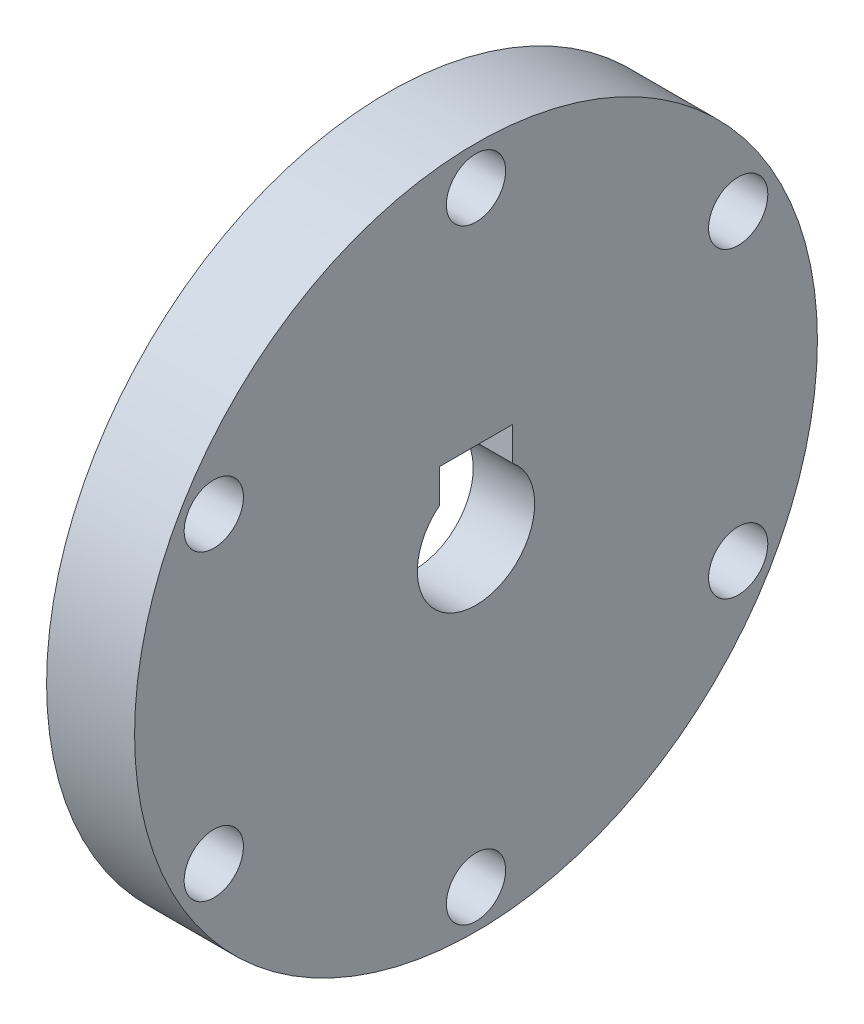
ISO-10303-21;
HEADER;
FILE_DESCRIPTION(('STEP AP214'),'2;1');
FILE_NAME('part.step','',(''),(''),'','','');
FILE_SCHEMA(('AUTOMOTIVE_DESIGN { 1 0 10303 214 1 1 1 1 }'));
ENDSEC;
DATA;
#1=APPLICATION_CONTEXT('core data for automotive mechanical design processes');
#2=APPLICATION_PROTOCOL_DEFINITION('international standard','automotive_design',2000,#1);
#3=PRODUCT_CONTEXT('',#1,'mechanical');
#4=PRODUCT('Part','Part','',(#3));
#5=PRODUCT_RELATED_PRODUCT_CATEGORY('part','',(#4));
#6=PRODUCT_DEFINITION_FORMATION('','',#4);
#7=PRODUCT_DEFINITION_CONTEXT('part definition',#1,'design');
#8=PRODUCT_DEFINITION('design','',#6,#7);
#9=PRODUCT_DEFINITION_SHAPE('','',#8);
#10=(LENGTH_UNIT() NAMED_UNIT(*) SI_UNIT(.MILLI.,.METRE.));
#11=(NAMED_UNIT(*) PLANE_ANGLE_UNIT() SI_UNIT($,.RADIAN.));
#12=(NAMED_UNIT(*) SI_UNIT($,.STERADIAN.) SOLID_ANGLE_UNIT());
#13=UNCERTAINTY_MEASURE_WITH_UNIT(LENGTH_MEASURE(1.E-05),#10,'distance_accuracy_value','');
#14=(GEOMETRIC_REPRESENTATION_CONTEXT(3) GLOBAL_UNCERTAINTY_ASSIGNED_CONTEXT((#13)) GLOBAL_UNIT_ASSIGNED_CONTEXT((#10,
#11,#12)) REPRESENTATION_CONTEXT('',''));
#15=CARTESIAN_POINT('',(0.,0.,0.));
#16=DIRECTION('',(0.,0.,1.));
#17=DIRECTION('',(1.,0.,0.));
#18=AXIS2_PLACEMENT_3D('',#15,#16,#17);
#19=CARTESIAN_POINT('',(6.,0.,0.));
#20=DIRECTION('',(1.,0.,0.));
#21=DIRECTION('',(0.,0.,-1.));
#22=AXIS2_PLACEMENT_3D('',#19,#20,#21);
#23=PLANE('',#22);
#24=DIRECTION('',(0.,1.,0.));
#25=VECTOR('',#24,1.);
#26=CARTESIAN_POINT('',(6.,3.1224989991992,-2.5));
#27=LINE('',#26,#25);
#28=CARTESIAN_POINT('',(6.,3.1224989991992,-2.5));
#29=VERTEX_POINT('',#28);
#30=CARTESIAN_POINT('',(6.,5.4224989991992,-2.5));
#31=VERTEX_POINT('',#30);
#32=EDGE_CURVE('E64',#29,#31,#27,.T.);
#33=ORIENTED_EDGE('',*,*,#32,.F.);
#34=CARTESIAN_POINT('',(6.,0.,0.));
#35=DIRECTION('',(1.,0.,0.));
#36=DIRECTION('',(0.,0.,-1.));
#37=AXIS2_PLACEMENT_3D('',#34,#35,#36);
#38=CIRCLE('',#37,4.);
#39=CARTESIAN_POINT('',(6.,3.1224989991992,2.5));
#40=VERTEX_POINT('',#39);
#41=EDGE_CURVE('E109',#40,#29,#38,.T.);
#42=ORIENTED_EDGE('',*,*,#41,.F.);
#43=DIRECTION('',(0.,-1.,0.));
#44=VECTOR('',#43,1.);
#45=CARTESIAN_POINT('',(6.,3.1224989991992,2.5));
#46=LINE('',#45,#44);
#47=CARTESIAN_POINT('',(6.,5.4224989991992,2.5));
#48=VERTEX_POINT('',#47);
#49=EDGE_CURVE('E92',#48,#40,#46,.T.);
#50=ORIENTED_EDGE('',*,*,#49,.F.);
#51=DIRECTION('',(0.,0.,1.));
#52=VECTOR('',#51,1.);
#53=CARTESIAN_POINT('',(6.,5.4224989991992,2.5));
#54=LINE('',#53,#52);
#55=EDGE_CURVE('E102',#31,#48,#54,.T.);
#56=ORIENTED_EDGE('',*,*,#55,.F.);
#57=EDGE_LOOP('',(#33,#42,#50,#56));
#58=FACE_BOUND('',#57,.T.);
#59=CARTESIAN_POINT('',(6.,-10.3199999999998,17.8747643341109));
#60=DIRECTION('',(1.,0.,0.));
#61=DIRECTION('',(0.,0.,-1.));
#62=AXIS2_PLACEMENT_3D('',#59,#60,#61);
#63=CIRCLE('',#62,2.01929999999999);
#64=CARTESIAN_POINT('',(6.,-10.3199999999998,15.8554643341109));
#65=VERTEX_POINT('',#64);
#66=EDGE_CURVE('E136',#65,#65,#63,.T.);
#67=ORIENTED_EDGE('',*,*,#66,.F.);
#68=EDGE_LOOP('',(#67));
#69=FACE_BOUND('',#68,.T.);
#70=CARTESIAN_POINT('',(6.,-10.3200000000001,-17.8747643341108));
#71=DIRECTION('',(1.,0.,0.));
#72=DIRECTION('',(0.,0.,-1.));
#73=AXIS2_PLACEMENT_3D('',#70,#71,#72);
#74=CIRCLE('',#73,2.01929999999999);
#75=CARTESIAN_POINT('',(6.,-10.3200000000001,-19.8940643341108));
#76=VERTEX_POINT('',#75);
#77=EDGE_CURVE('E152',#76,#76,#74,.T.);
#78=ORIENTED_EDGE('',*,*,#77,.F.);
#79=EDGE_LOOP('',(#78));
#80=FACE_BOUND('',#79,.T.);
#81=CARTESIAN_POINT('',(6.,20.64,0.));
#82=DIRECTION('',(1.,0.,0.));
#83=DIRECTION('',(0.,0.,-1.));
#84=AXIS2_PLACEMENT_3D('',#81,#82,#83);
#85=CIRCLE('',#84,2.01929999999999);
#86=CARTESIAN_POINT('',(6.,20.64,-2.01929999999999));
#87=VERTEX_POINT('',#86);
#88=EDGE_CURVE('E168',#87,#87,#85,.T.);
#89=ORIENTED_EDGE('',*,*,#88,.F.);
#90=EDGE_LOOP('',(#89));
#91=FACE_BOUND('',#90,.T.);
#92=CARTESIAN_POINT('',(6.,0.,0.));
#93=DIRECTION('',(1.,0.,0.));
#94=DIRECTION('',(0.,0.,-1.));
#95=AXIS2_PLACEMENT_3D('',#92,#93,#94);
#96=CIRCLE('',#95,23.2760744987721);
#97=CARTESIAN_POINT('',(6.,0.,-23.2760744987721));
#98=VERTEX_POINT('',#97);
#99=EDGE_CURVE('E176',#98,#98,#96,.T.);
#100=ORIENTED_EDGE('',*,*,#99,.T.);
#101=EDGE_LOOP('',(#100));
#102=FACE_BOUND('',#101,.T.);
#103=CARTESIAN_POINT('',(6.,10.32,-17.8747643341108));
#104=DIRECTION('',(1.,0.,0.));
#105=DIRECTION('',(0.,0.,-1.));
#106=AXIS2_PLACEMENT_3D('',#103,#104,#105);
#107=CIRCLE('',#106,2.01929999999999);
#108=CARTESIAN_POINT('',(6.,10.32,-19.8940643341108));
#109=VERTEX_POINT('',#108);
#110=EDGE_CURVE('E160',#109,#109,#107,.T.);
#111=ORIENTED_EDGE('',*,*,#110,.F.);
#112=EDGE_LOOP('',(#111));
#113=FACE_BOUND('',#112,.T.);
#114=CARTESIAN_POINT('',(6.,-20.64,1.44128349667445E-13));
#115=DIRECTION('',(1.,0.,0.));
#116=DIRECTION('',(0.,0.,-1.));
#117=AXIS2_PLACEMENT_3D('',#114,#115,#116);
#118=CIRCLE('',#117,2.01929999999999);
#119=CARTESIAN_POINT('',(6.,-20.64,-2.01929999999985));
#120=VERTEX_POINT('',#119);
#121=EDGE_CURVE('E144',#120,#120,#118,.T.);
#122=ORIENTED_EDGE('',*,*,#121,.F.);
#123=EDGE_LOOP('',(#122));
#124=FACE_BOUND('',#123,.T.);
#125=CARTESIAN_POINT('',(6.,10.3200000000002,17.8747643341107));
#126=DIRECTION('',(1.,0.,0.));
#127=DIRECTION('',(0.,0.,-1.));
#128=AXIS2_PLACEMENT_3D('',#125,#126,#127);
#129=CIRCLE('',#128,2.01929999999999);
#130=CARTESIAN_POINT('',(6.,10.3200000000002,15.8554643341107));
#131=VERTEX_POINT('',#130);
#132=EDGE_CURVE('E128',#131,#131,#129,.T.);
#133=ORIENTED_EDGE('',*,*,#132,.F.);
#134=EDGE_LOOP('',(#133));
#135=FACE_BOUND('',#134,.T.);
#136=ADVANCED_FACE('F47',(#58,#69,#80,#91,#102,#113,#124,#135),#23,.T.);
#137=CARTESIAN_POINT('',(0.,0.,0.));
#138=DIRECTION('',(1.,0.,0.));
#139=DIRECTION('',(0.,0.,-1.));
#140=AXIS2_PLACEMENT_3D('',#137,#138,#139);
#141=PLANE('',#140);
#142=CARTESIAN_POINT('',(0.,0.,0.));
#143=DIRECTION('',(1.,0.,0.));
#144=DIRECTION('',(0.,0.,-1.));
#145=AXIS2_PLACEMENT_3D('',#142,#143,#144);
#146=CIRCLE('',#145,17.46);
#147=CARTESIAN_POINT('',(0.,0.,-17.46));
#148=VERTEX_POINT('',#147);
#149=EDGE_CURVE('E180',#148,#148,#146,.F.);
#150=ORIENTED_EDGE('',*,*,#149,.F.);
#151=EDGE_LOOP('',(#150));
#152=FACE_BOUND('',#151,.T.);
#153=CARTESIAN_POINT('',(0.,0.,0.));
#154=DIRECTION('',(1.,0.,0.));
#155=DIRECTION('',(0.,0.,-1.));
#156=AXIS2_PLACEMENT_3D('',#153,#154,#155);
#157=CIRCLE('',#156,23.2760744987721);
#158=CARTESIAN_POINT('',(0.,0.,-23.2760744987721));
#159=VERTEX_POINT('',#158);
#160=EDGE_CURVE('E172',#159,#159,#157,.T.);
#161=ORIENTED_EDGE('',*,*,#160,.F.);
#162=EDGE_LOOP('',(#161));
#163=FACE_BOUND('',#162,.T.);
#164=CARTESIAN_POINT('',(0.,20.64,0.));
#165=DIRECTION('',(1.,0.,0.));
#166=DIRECTION('',(0.,0.,-1.));
#167=AXIS2_PLACEMENT_3D('',#164,#165,#166);
#168=CIRCLE('',#167,2.01929999999999);
#169=CARTESIAN_POINT('',(0.,20.64,-2.01929999999999));
#170=VERTEX_POINT('',#169);
#171=EDGE_CURVE('E164',#170,#170,#168,.T.);
#172=ORIENTED_EDGE('',*,*,#171,.T.);
#173=EDGE_LOOP('',(#172));
#174=FACE_BOUND('',#173,.T.);
#175=CARTESIAN_POINT('',(0.,10.32,-17.8747643341108));
#176=DIRECTION('',(1.,0.,0.));
#177=DIRECTION('',(0.,0.,-1.));
#178=AXIS2_PLACEMENT_3D('',#175,#176,#177);
#179=CIRCLE('',#178,2.01929999999999);
#180=CARTESIAN_POINT('',(0.,10.32,-19.8940643341108));
#181=VERTEX_POINT('',#180);
#182=EDGE_CURVE('E156',#181,#181,#179,.T.);
#183=ORIENTED_EDGE('',*,*,#182,.T.);
#184=EDGE_LOOP('',(#183));
#185=FACE_BOUND('',#184,.T.);
#186=CARTESIAN_POINT('',(0.,-10.3200000000001,-17.8747643341108));
#187=DIRECTION('',(1.,0.,0.));
#188=DIRECTION('',(0.,0.,-1.));
#189=AXIS2_PLACEMENT_3D('',#186,#187,#188);
#190=CIRCLE('',#189,2.01929999999999);
#191=CARTESIAN_POINT('',(0.,-10.3200000000001,-19.8940643341108));
#192=VERTEX_POINT('',#191);
#193=EDGE_CURVE('E148',#192,#192,#190,.T.);
#194=ORIENTED_EDGE('',*,*,#193,.T.);
#195=EDGE_LOOP('',(#194));
#196=FACE_BOUND('',#195,.T.);
#197=CARTESIAN_POINT('',(0.,-20.64,1.44128349667445E-13));
#198=DIRECTION('',(1.,0.,0.));
#199=DIRECTION('',(0.,0.,-1.));
#200=AXIS2_PLACEMENT_3D('',#197,#198,#199);
#201=CIRCLE('',#200,2.01929999999999);
#202=CARTESIAN_POINT('',(0.,-20.64,-2.01929999999985));
#203=VERTEX_POINT('',#202);
#204=EDGE_CURVE('E140',#203,#203,#201,.T.);
#205=ORIENTED_EDGE('',*,*,#204,.T.);
#206=EDGE_LOOP('',(#205));
#207=FACE_BOUND('',#206,.T.);
#208=CARTESIAN_POINT('',(0.,-10.3199999999998,17.8747643341109));
#209=DIRECTION('',(1.,0.,0.));
#210=DIRECTION('',(0.,0.,-1.));
#211=AXIS2_PLACEMENT_3D('',#208,#209,#210);
#212=CIRCLE('',#211,2.01929999999999);
#213=CARTESIAN_POINT('',(0.,-10.3199999999998,15.8554643341109));
#214=VERTEX_POINT('',#213);
#215=EDGE_CURVE('E132',#214,#214,#212,.T.);
#216=ORIENTED_EDGE('',*,*,#215,.T.);
#217=EDGE_LOOP('',(#216));
#218=FACE_BOUND('',#217,.T.);
#219=CARTESIAN_POINT('',(0.,10.3200000000002,17.8747643341107));
#220=DIRECTION('',(1.,0.,0.));
#221=DIRECTION('',(0.,0.,-1.));
#222=AXIS2_PLACEMENT_3D('',#219,#220,#221);
#223=CIRCLE('',#222,2.01929999999999);
#224=CARTESIAN_POINT('',(0.,10.3200000000002,15.8554643341107));
#225=VERTEX_POINT('',#224);
#226=EDGE_CURVE('E127',#225,#225,#223,.T.);
#227=ORIENTED_EDGE('',*,*,#226,.T.);
#228=EDGE_LOOP('',(#227));
#229=FACE_BOUND('',#228,.T.);
#230=ADVANCED_FACE('F231',(#152,#163,#174,#185,#196,#207,#218,#229),#141,.F.);
#231=CARTESIAN_POINT('',(6.,0.,0.));
#232=DIRECTION('',(-1.,0.,0.));
#233=DIRECTION('',(0.,0.,1.));
#234=AXIS2_PLACEMENT_3D('',#231,#232,#233);
#235=CYLINDRICAL_SURFACE('',#234,23.2760744987721);
#236=ORIENTED_EDGE('',*,*,#99,.F.);
#237=EDGE_LOOP('',(#236));
#238=FACE_BOUND('',#237,.T.);
#239=ORIENTED_EDGE('',*,*,#160,.T.);
#240=EDGE_LOOP('',(#239));
#241=FACE_BOUND('',#240,.T.);
#242=ADVANCED_FACE('F236',(#238,#241),#235,.T.);
#243=CARTESIAN_POINT('',(6.,20.64,0.));
#244=DIRECTION('',(-1.,0.,0.));
#245=DIRECTION('',(0.,0.,1.));
#246=AXIS2_PLACEMENT_3D('',#243,#244,#245);
#247=CYLINDRICAL_SURFACE('',#246,2.01929999999999);
#248=ORIENTED_EDGE('',*,*,#88,.T.);
#249=EDGE_LOOP('',(#248));
#250=FACE_BOUND('',#249,.T.);
#251=ORIENTED_EDGE('',*,*,#171,.F.);
#252=EDGE_LOOP('',(#251));
#253=FACE_BOUND('',#252,.T.);
#254=ADVANCED_FACE('F240',(#250,#253),#247,.F.);
#255=CARTESIAN_POINT('',(6.,10.32,-17.8747643341108));
#256=DIRECTION('',(-1.,0.,0.));
#257=DIRECTION('',(0.,0.,1.));
#258=AXIS2_PLACEMENT_3D('',#255,#256,#257);
#259=CYLINDRICAL_SURFACE('',#258,2.01929999999999);
#260=ORIENTED_EDGE('',*,*,#110,.T.);
#261=EDGE_LOOP('',(#260));
#262=FACE_BOUND('',#261,.T.);
#263=ORIENTED_EDGE('',*,*,#182,.F.);
#264=EDGE_LOOP('',(#263));
#265=FACE_BOUND('',#264,.T.);
#266=ADVANCED_FACE('F287',(#262,#265),#259,.F.);
#267=CARTESIAN_POINT('',(6.,-10.3200000000001,-17.8747643341108));
#268=DIRECTION('',(-1.,0.,0.));
#269=DIRECTION('',(0.,0.,1.));
#270=AXIS2_PLACEMENT_3D('',#267,#268,#269);
#271=CYLINDRICAL_SURFACE('',#270,2.01929999999999);
#272=ORIENTED_EDGE('',*,*,#77,.T.);
#273=EDGE_LOOP('',(#272));
#274=FACE_BOUND('',#273,.T.);
#275=ORIENTED_EDGE('',*,*,#193,.F.);
#276=EDGE_LOOP('',(#275));
#277=FACE_BOUND('',#276,.T.);
#278=ADVANCED_FACE('F284',(#274,#277),#271,.F.);
#279=CARTESIAN_POINT('',(6.,-20.64,1.44128349667445E-13));
#280=DIRECTION('',(-1.,0.,0.));
#281=DIRECTION('',(0.,0.,1.));
#282=AXIS2_PLACEMENT_3D('',#279,#280,#281);
#283=CYLINDRICAL_SURFACE('',#282,2.01929999999999);
#284=ORIENTED_EDGE('',*,*,#121,.T.);
#285=EDGE_LOOP('',(#284));
#286=FACE_BOUND('',#285,.T.);
#287=ORIENTED_EDGE('',*,*,#204,.F.);
#288=EDGE_LOOP('',(#287));
#289=FACE_BOUND('',#288,.T.);
#290=ADVANCED_FACE('F280',(#286,#289),#283,.F.);
#291=CARTESIAN_POINT('',(6.,-10.3199999999998,17.8747643341109));
#292=DIRECTION('',(-1.,0.,0.));
#293=DIRECTION('',(0.,0.,1.));
#294=AXIS2_PLACEMENT_3D('',#291,#292,#293);
#295=CYLINDRICAL_SURFACE('',#294,2.01929999999999);
#296=ORIENTED_EDGE('',*,*,#66,.T.);
#297=EDGE_LOOP('',(#296));
#298=FACE_BOUND('',#297,.T.);
#299=ORIENTED_EDGE('',*,*,#215,.F.);
#300=EDGE_LOOP('',(#299));
#301=FACE_BOUND('',#300,.T.);
#302=ADVANCED_FACE('F274',(#298,#301),#295,.F.);
#303=CARTESIAN_POINT('',(6.,10.3200000000002,17.8747643341107));
#304=DIRECTION('',(-1.,0.,0.));
#305=DIRECTION('',(0.,0.,1.));
#306=AXIS2_PLACEMENT_3D('',#303,#304,#305);
#307=CYLINDRICAL_SURFACE('',#306,2.01929999999999);
#308=ORIENTED_EDGE('',*,*,#132,.T.);
#309=EDGE_LOOP('',(#308));
#310=FACE_BOUND('',#309,.T.);
#311=ORIENTED_EDGE('',*,*,#226,.F.);
#312=EDGE_LOOP('',(#311));
#313=FACE_BOUND('',#312,.T.);
#314=ADVANCED_FACE('F265',(#310,#313),#307,.F.);
#315=CARTESIAN_POINT('',(-2.,0.,0.));
#316=DIRECTION('',(-1.,0.,0.));
#317=DIRECTION('',(0.,0.,1.));
#318=AXIS2_PLACEMENT_3D('',#315,#316,#317);
#319=PLANE('',#318);
#320=CARTESIAN_POINT('',(-2.,0.,0.));
#321=DIRECTION('',(-1.,0.,0.));
#322=DIRECTION('',(0.,0.,1.));
#323=AXIS2_PLACEMENT_3D('',#320,#321,#322);
#324=CIRCLE('',#323,16.46);
#325=CARTESIAN_POINT('',(-2.,0.,16.46));
#326=VERTEX_POINT('',#325);
#327=EDGE_CURVE('E195',#326,#326,#324,.T.);
#328=ORIENTED_EDGE('',*,*,#327,.T.);
#329=EDGE_LOOP('',(#328));
#330=FACE_BOUND('',#329,.T.);
#331=CARTESIAN_POINT('',(-2.,0.,0.));
#332=DIRECTION('',(-1.,0.,0.));
#333=DIRECTION('',(0.,0.,1.));
#334=AXIS2_PLACEMENT_3D('',#331,#332,#333);
#335=CIRCLE('',#334,15.);
#336=CARTESIAN_POINT('',(-2.,0.,15.));
#337=VERTEX_POINT('',#336);
#338=EDGE_CURVE('E119',#337,#337,#335,.T.);
#339=ORIENTED_EDGE('',*,*,#338,.F.);
#340=EDGE_LOOP('',(#339));
#341=FACE_BOUND('',#340,.T.);
#342=ADVANCED_FACE('F264',(#330,#341),#319,.T.);
#343=CARTESIAN_POINT('',(-2.,0.,0.));
#344=DIRECTION('',(1.,0.,0.));
#345=DIRECTION('',(0.,0.,-1.));
#346=AXIS2_PLACEMENT_3D('',#343,#344,#345);
#347=CYLINDRICAL_SURFACE('',#346,17.46);
#348=CARTESIAN_POINT('',(-0.999999999999999,0.,0.));
#349=DIRECTION('',(-1.,0.,0.));
#350=DIRECTION('',(0.,0.,1.));
#351=AXIS2_PLACEMENT_3D('',#348,#349,#350);
#352=CIRCLE('',#351,17.46);
#353=CARTESIAN_POINT('',(-0.999999999999999,0.,17.46));
#354=VERTEX_POINT('',#353);
#355=EDGE_CURVE('E199',#354,#354,#352,.F.);
#356=ORIENTED_EDGE('',*,*,#355,.T.);
#357=EDGE_LOOP('',(#356));
#358=FACE_BOUND('',#357,.T.);
#359=ORIENTED_EDGE('',*,*,#149,.T.);
#360=EDGE_LOOP('',(#359));
#361=FACE_BOUND('',#360,.T.);
#362=ADVANCED_FACE('F260',(#358,#361),#347,.T.);
#363=CARTESIAN_POINT('',(-2.,0.,0.));
#364=DIRECTION('',(1.,0.,0.));
#365=DIRECTION('',(0.,0.,-1.));
#366=AXIS2_PLACEMENT_3D('',#363,#364,#365);
#367=CYLINDRICAL_SURFACE('',#366,15.);
#368=CARTESIAN_POINT('',(-0.687499999999992,0.,0.));
#369=DIRECTION('',(-1.,0.,0.));
#370=DIRECTION('',(0.,0.,1.));
#371=AXIS2_PLACEMENT_3D('',#368,#369,#370);
#372=CIRCLE('',#371,15.);
#373=CARTESIAN_POINT('',(-0.687499999999992,0.,15.));
#374=VERTEX_POINT('',#373);
#375=EDGE_CURVE('E191',#374,#374,#372,.F.);
#376=ORIENTED_EDGE('',*,*,#375,.T.);
#377=EDGE_LOOP('',(#376));
#378=FACE_BOUND('',#377,.T.);
#379=ORIENTED_EDGE('',*,*,#338,.T.);
#380=EDGE_LOOP('',(#379));
#381=FACE_BOUND('',#380,.T.);
#382=ADVANCED_FACE('F254',(#378,#381),#367,.F.);
#383=CARTESIAN_POINT('',(1.8125,0.,0.));
#384=DIRECTION('',(-1.,0.,0.));
#385=DIRECTION('',(0.,0.,1.));
#386=AXIS2_PLACEMENT_3D('',#383,#384,#385);
#387=PLANE('',#386);
#388=DIRECTION('',(0.,-1.,0.));
#389=VECTOR('',#388,1.);
#390=CARTESIAN_POINT('',(1.8125,0.,-2.5));
#391=LINE('',#390,#389);
#392=CARTESIAN_POINT('',(1.81249999999999,5.4224989991992,-2.5));
#393=VERTEX_POINT('',#392);
#394=CARTESIAN_POINT('',(1.81249999999999,3.1224989991992,-2.5));
#395=VERTEX_POINT('',#394);
#396=EDGE_CURVE('E11',#393,#395,#391,.T.);
#397=ORIENTED_EDGE('',*,*,#396,.F.);
#398=DIRECTION('',(0.,0.,-1.));
#399=VECTOR('',#398,1.);
#400=CARTESIAN_POINT('',(1.8125,5.4224989991992,0.));
#401=LINE('',#400,#399);
#402=CARTESIAN_POINT('',(1.8125,5.4224989991992,2.5));
#403=VERTEX_POINT('',#402);
#404=EDGE_CURVE('E203',#403,#393,#401,.T.);
#405=ORIENTED_EDGE('',*,*,#404,.F.);
#406=DIRECTION('',(0.,1.,0.));
#407=VECTOR('',#406,1.);
#408=CARTESIAN_POINT('',(1.8125,0.,2.5));
#409=LINE('',#408,#407);
#410=CARTESIAN_POINT('',(1.81249999999999,3.1224989991992,2.5));
#411=VERTEX_POINT('',#410);
#412=EDGE_CURVE('E95',#411,#403,#409,.T.);
#413=ORIENTED_EDGE('',*,*,#412,.F.);
#414=CARTESIAN_POINT('',(1.8125,0.,0.));
#415=DIRECTION('',(-1.,0.,0.));
#416=DIRECTION('',(0.,0.,1.));
#417=AXIS2_PLACEMENT_3D('',#414,#415,#416);
#418=CIRCLE('',#417,4.);
#419=EDGE_CURVE('E57',#395,#411,#418,.T.);
#420=ORIENTED_EDGE('',*,*,#419,.F.);
#421=EDGE_LOOP('',(#397,#405,#413,#420));
#422=FACE_BOUND('',#421,.T.);
#423=CARTESIAN_POINT('',(1.8125,0.,0.));
#424=DIRECTION('',(-1.,0.,0.));
#425=DIRECTION('',(0.,0.,1.));
#426=AXIS2_PLACEMENT_3D('',#423,#424,#425);
#427=CIRCLE('',#426,12.5);
#428=CARTESIAN_POINT('',(1.8125,0.,12.5));
#429=VERTEX_POINT('',#428);
#430=EDGE_CURVE('E187',#429,#429,#427,.T.);
#431=ORIENTED_EDGE('',*,*,#430,.T.);
#432=EDGE_LOOP('',(#431));
#433=FACE_BOUND('',#432,.T.);
#434=ADVANCED_FACE('F214',(#422,#433),#387,.T.);
#435=CARTESIAN_POINT('',(1.8125,0.,0.));
#436=DIRECTION('',(-1.,0.,0.));
#437=DIRECTION('',(0.,0.,1.));
#438=AXIS2_PLACEMENT_3D('',#435,#436,#437);
#439=CONICAL_SURFACE('',#438,12.5,0.785398163397454);
#440=ORIENTED_EDGE('',*,*,#375,.F.);
#441=EDGE_LOOP('',(#440));
#442=FACE_BOUND('',#441,.T.);
#443=ORIENTED_EDGE('',*,*,#430,.F.);
#444=EDGE_LOOP('',(#443));
#445=FACE_BOUND('',#444,.T.);
#446=ADVANCED_FACE('F226',(#442,#445),#439,.F.);
#447=CARTESIAN_POINT('',(-2.,0.,0.));
#448=DIRECTION('',(1.,0.,0.));
#449=DIRECTION('',(0.,0.,-1.));
#450=AXIS2_PLACEMENT_3D('',#447,#448,#449);
#451=CONICAL_SURFACE('',#450,16.46,0.785398163397447);
#452=ORIENTED_EDGE('',*,*,#355,.F.);
#453=EDGE_LOOP('',(#452));
#454=FACE_BOUND('',#453,.T.);
#455=ORIENTED_EDGE('',*,*,#327,.F.);
#456=EDGE_LOOP('',(#455));
#457=FACE_BOUND('',#456,.T.);
#458=ADVANCED_FACE('F50',(#454,#457),#451,.T.);
#459=CARTESIAN_POINT('',(-14.5,3.1224989991992,-2.5));
#460=DIRECTION('',(0.,0.,-1.));
#461=DIRECTION('',(-1.,0.,0.));
#462=AXIS2_PLACEMENT_3D('',#459,#460,#461);
#463=PLANE('',#462);
#464=ORIENTED_EDGE('',*,*,#396,.T.);
#465=DIRECTION('',(1.,0.,0.));
#466=VECTOR('',#465,1.);
#467=CARTESIAN_POINT('',(-14.5,3.1224989991992,-2.5));
#468=LINE('',#467,#466);
#469=EDGE_CURVE('E116',#395,#29,#468,.T.);
#470=ORIENTED_EDGE('',*,*,#469,.T.);
#471=ORIENTED_EDGE('',*,*,#32,.T.);
#472=DIRECTION('',(1.,0.,0.));
#473=VECTOR('',#472,1.);
#474=CARTESIAN_POINT('',(-14.5,5.4224989991992,-2.5));
#475=LINE('',#474,#473);
#476=EDGE_CURVE('E99',#393,#31,#475,.T.);
#477=ORIENTED_EDGE('',*,*,#476,.F.);
#478=EDGE_LOOP('',(#464,#470,#471,#477));
#479=FACE_BOUND('',#478,.T.);
#480=ADVANCED_FACE('F216',(#479),#463,.F.);
#481=CARTESIAN_POINT('',(-14.5,0.,0.));
#482=DIRECTION('',(1.,0.,0.));
#483=DIRECTION('',(0.,0.,-1.));
#484=AXIS2_PLACEMENT_3D('',#481,#482,#483);
#485=CYLINDRICAL_SURFACE('',#484,4.);
#486=ORIENTED_EDGE('',*,*,#419,.T.);
#487=DIRECTION('',(1.,0.,0.));
#488=VECTOR('',#487,1.);
#489=CARTESIAN_POINT('',(-14.5,3.1224989991992,2.5));
#490=LINE('',#489,#488);
#491=EDGE_CURVE('E98',#411,#40,#490,.T.);
#492=ORIENTED_EDGE('',*,*,#491,.T.);
#493=ORIENTED_EDGE('',*,*,#41,.T.);
#494=ORIENTED_EDGE('',*,*,#469,.F.);
#495=EDGE_LOOP('',(#486,#492,#493,#494));
#496=FACE_BOUND('',#495,.T.);
#497=ADVANCED_FACE('F211',(#496),#485,.F.);
#498=CARTESIAN_POINT('',(-14.5,3.1224989991992,2.5));
#499=DIRECTION('',(0.,0.,1.));
#500=DIRECTION('',(1.,0.,0.));
#501=AXIS2_PLACEMENT_3D('',#498,#499,#500);
#502=PLANE('',#501);
#503=ORIENTED_EDGE('',*,*,#412,.T.);
#504=DIRECTION('',(1.,0.,0.));
#505=VECTOR('',#504,1.);
#506=CARTESIAN_POINT('',(-14.5,5.4224989991992,2.5));
#507=LINE('',#506,#505);
#508=EDGE_CURVE('E72',#403,#48,#507,.T.);
#509=ORIENTED_EDGE('',*,*,#508,.T.);
#510=ORIENTED_EDGE('',*,*,#49,.T.);
#511=ORIENTED_EDGE('',*,*,#491,.F.);
#512=EDGE_LOOP('',(#503,#509,#510,#511));
#513=FACE_BOUND('',#512,.T.);
#514=ADVANCED_FACE('F89',(#513),#502,.F.);
#515=CARTESIAN_POINT('',(-14.5,5.4224989991992,2.5));
#516=DIRECTION('',(0.,1.,0.));
#517=DIRECTION('',(0.,0.,1.));
#518=AXIS2_PLACEMENT_3D('',#515,#516,#517);
#519=PLANE('',#518);
#520=ORIENTED_EDGE('',*,*,#404,.T.);
#521=ORIENTED_EDGE('',*,*,#476,.T.);
#522=ORIENTED_EDGE('',*,*,#55,.T.);
#523=ORIENTED_EDGE('',*,*,#508,.F.);
#524=EDGE_LOOP('',(#520,#521,#522,#523));
#525=FACE_BOUND('',#524,.T.);
#526=ADVANCED_FACE('F103',(#525),#519,.F.);
#527=CLOSED_SHELL('',(#136,#230,#242,#254,#266,#278,#290,#302,#314,#342,#362,#382,#434,#446,
#458,#480,#497,#514,#526));
#528=MANIFOLD_SOLID_BREP('B2',#527);
#529=ADVANCED_BREP_SHAPE_REPRESENTATION('',(#18,#528),#14);
#530=SHAPE_DEFINITION_REPRESENTATION(#9,#529);
ENDSEC;
END-ISO-10303-21;
